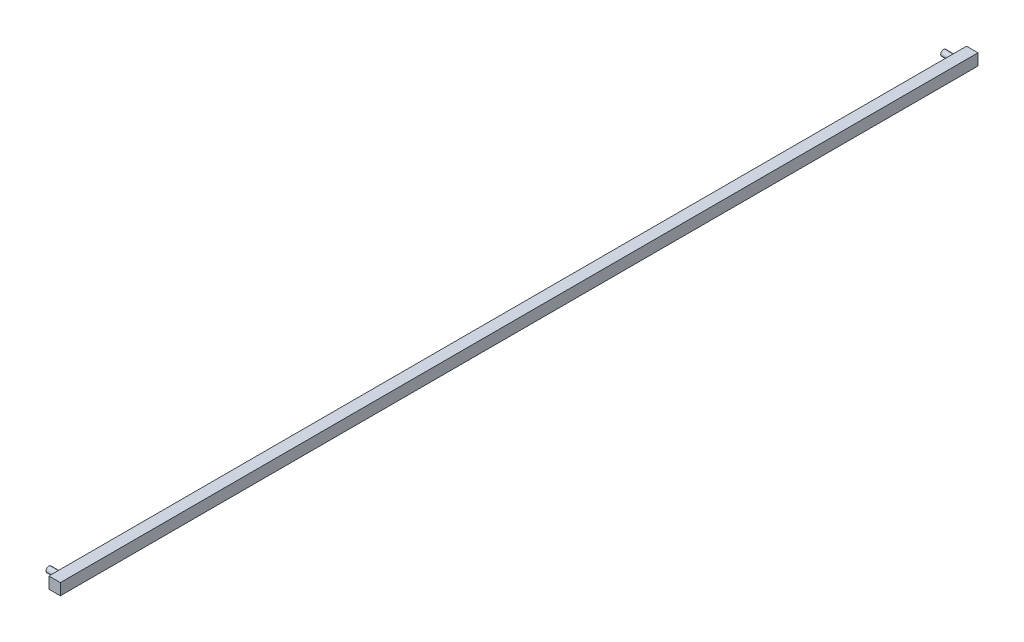
ISO-10303-21;
HEADER;
FILE_DESCRIPTION(('STEP AP214'),'2;1');
FILE_NAME('part.step','',(''),(''),'','','');
FILE_SCHEMA(('AUTOMOTIVE_DESIGN { 1 0 10303 214 1 1 1 1 }'));
ENDSEC;
DATA;
#1=APPLICATION_CONTEXT('core data for automotive mechanical design processes');
#2=APPLICATION_PROTOCOL_DEFINITION('international standard','automotive_design',2000,#1);
#3=PRODUCT_CONTEXT('',#1,'mechanical');
#4=PRODUCT('Part','Part','',(#3));
#5=PRODUCT_RELATED_PRODUCT_CATEGORY('part','',(#4));
#6=PRODUCT_DEFINITION_FORMATION('','',#4);
#7=PRODUCT_DEFINITION_CONTEXT('part definition',#1,'design');
#8=PRODUCT_DEFINITION('design','',#6,#7);
#9=PRODUCT_DEFINITION_SHAPE('','',#8);
#10=(LENGTH_UNIT() NAMED_UNIT(*) SI_UNIT(.MILLI.,.METRE.));
#11=(NAMED_UNIT(*) PLANE_ANGLE_UNIT() SI_UNIT($,.RADIAN.));
#12=(NAMED_UNIT(*) SI_UNIT($,.STERADIAN.) SOLID_ANGLE_UNIT());
#13=UNCERTAINTY_MEASURE_WITH_UNIT(LENGTH_MEASURE(1.E-05),#10,'distance_accuracy_value','');
#14=(GEOMETRIC_REPRESENTATION_CONTEXT(3) GLOBAL_UNCERTAINTY_ASSIGNED_CONTEXT((#13)) GLOBAL_UNIT_ASSIGNED_CONTEXT((#10,
#11,#12)) REPRESENTATION_CONTEXT('',''));
#15=CARTESIAN_POINT('',(0.,0.,0.));
#16=DIRECTION('',(0.,0.,1.));
#17=DIRECTION('',(1.,0.,0.));
#18=AXIS2_PLACEMENT_3D('',#15,#16,#17);
#19=CARTESIAN_POINT('',(5.,-5.,800.));
#20=DIRECTION('',(-1.,0.,0.));
#21=DIRECTION('',(0.,0.,1.));
#22=AXIS2_PLACEMENT_3D('',#19,#20,#21);
#23=PLANE('',#22);
#24=DIRECTION('',(0.,1.,0.));
#25=VECTOR('',#24,1.);
#26=CARTESIAN_POINT('',(5.,-5.,0.));
#27=LINE('',#26,#25);
#28=CARTESIAN_POINT('',(5.,-5.,0.));
#29=VERTEX_POINT('',#28);
#30=CARTESIAN_POINT('',(5.,5.,0.));
#31=VERTEX_POINT('',#30);
#32=EDGE_CURVE('E111',#29,#31,#27,.T.);
#33=ORIENTED_EDGE('',*,*,#32,.T.);
#34=DIRECTION('',(0.,0.,-1.));
#35=VECTOR('',#34,1.);
#36=CARTESIAN_POINT('',(5.,5.,800.));
#37=LINE('',#36,#35);
#38=CARTESIAN_POINT('',(5.,5.,800.));
#39=VERTEX_POINT('',#38);
#40=EDGE_CURVE('E100',#39,#31,#37,.T.);
#41=ORIENTED_EDGE('',*,*,#40,.F.);
#42=DIRECTION('',(0.,1.,0.));
#43=VECTOR('',#42,1.);
#44=CARTESIAN_POINT('',(5.,-5.,800.));
#45=LINE('',#44,#43);
#46=CARTESIAN_POINT('',(5.,-5.,800.));
#47=VERTEX_POINT('',#46);
#48=EDGE_CURVE('E92',#47,#39,#45,.T.);
#49=ORIENTED_EDGE('',*,*,#48,.F.);
#50=DIRECTION('',(0.,0.,-1.));
#51=VECTOR('',#50,1.);
#52=CARTESIAN_POINT('',(5.,-5.,800.));
#53=LINE('',#52,#51);
#54=EDGE_CURVE('E107',#47,#29,#53,.T.);
#55=ORIENTED_EDGE('',*,*,#54,.T.);
#56=EDGE_LOOP('',(#33,#41,#49,#55));
#57=FACE_BOUND('',#56,.T.);
#58=ADVANCED_FACE('F39',(#57),#23,.F.);
#59=CARTESIAN_POINT('',(-5.,5.,800.));
#60=DIRECTION('',(0.,-1.,0.));
#61=DIRECTION('',(0.,0.,-1.));
#62=AXIS2_PLACEMENT_3D('',#59,#60,#61);
#63=PLANE('',#62);
#64=DIRECTION('',(-1.,0.,0.));
#65=VECTOR('',#64,1.);
#66=CARTESIAN_POINT('',(-5.,5.,0.));
#67=LINE('',#66,#65);
#68=CARTESIAN_POINT('',(-5.,5.,0.));
#69=VERTEX_POINT('',#68);
#70=EDGE_CURVE('E98',#31,#69,#67,.T.);
#71=ORIENTED_EDGE('',*,*,#70,.T.);
#72=DIRECTION('',(0.,0.,-1.));
#73=VECTOR('',#72,1.);
#74=CARTESIAN_POINT('',(-5.,5.,800.));
#75=LINE('',#74,#73);
#76=CARTESIAN_POINT('',(-5.,5.,800.));
#77=VERTEX_POINT('',#76);
#78=EDGE_CURVE('E96',#77,#69,#75,.T.);
#79=ORIENTED_EDGE('',*,*,#78,.F.);
#80=DIRECTION('',(-1.,0.,0.));
#81=VECTOR('',#80,1.);
#82=CARTESIAN_POINT('',(-5.,5.,800.));
#83=LINE('',#82,#81);
#84=EDGE_CURVE('E87',#39,#77,#83,.T.);
#85=ORIENTED_EDGE('',*,*,#84,.F.);
#86=ORIENTED_EDGE('',*,*,#40,.T.);
#87=EDGE_LOOP('',(#71,#79,#85,#86));
#88=FACE_BOUND('',#87,.T.);
#89=ADVANCED_FACE('F97',(#88),#63,.F.);
#90=CARTESIAN_POINT('',(-5.,-5.,800.));
#91=DIRECTION('',(1.,0.,0.));
#92=DIRECTION('',(0.,0.,-1.));
#93=AXIS2_PLACEMENT_3D('',#90,#91,#92);
#94=PLANE('',#93);
#95=CARTESIAN_POINT('',(-5.,0.,790.));
#96=DIRECTION('',(1.,0.,0.));
#97=DIRECTION('',(0.,0.,-1.));
#98=AXIS2_PLACEMENT_3D('',#95,#96,#97);
#99=CIRCLE('',#98,2.49999999999991);
#100=CARTESIAN_POINT('',(-5.,0.,787.5));
#101=VERTEX_POINT('',#100);
#102=EDGE_CURVE('E11',#101,#101,#99,.F.);
#103=ORIENTED_EDGE('',*,*,#102,.F.);
#104=EDGE_LOOP('',(#103));
#105=FACE_BOUND('',#104,.T.);
#106=CARTESIAN_POINT('',(-5.,0.,10.));
#107=DIRECTION('',(1.,0.,0.));
#108=DIRECTION('',(0.,0.,-1.));
#109=AXIS2_PLACEMENT_3D('',#106,#107,#108);
#110=CIRCLE('',#109,2.5);
#111=CARTESIAN_POINT('',(-5.,0.,7.5));
#112=VERTEX_POINT('',#111);
#113=EDGE_CURVE('E48',#112,#112,#110,.F.);
#114=ORIENTED_EDGE('',*,*,#113,.F.);
#115=EDGE_LOOP('',(#114));
#116=FACE_BOUND('',#115,.T.);
#117=DIRECTION('',(0.,-1.,0.));
#118=VECTOR('',#117,1.);
#119=CARTESIAN_POINT('',(-5.,-5.,0.));
#120=LINE('',#119,#118);
#121=CARTESIAN_POINT('',(-5.,-5.,0.));
#122=VERTEX_POINT('',#121);
#123=EDGE_CURVE('E73',#69,#122,#120,.T.);
#124=ORIENTED_EDGE('',*,*,#123,.T.);
#125=DIRECTION('',(0.,0.,-1.));
#126=VECTOR('',#125,1.);
#127=CARTESIAN_POINT('',(-5.,-5.,800.));
#128=LINE('',#127,#126);
#129=CARTESIAN_POINT('',(-5.,-5.,800.));
#130=VERTEX_POINT('',#129);
#131=EDGE_CURVE('E101',#130,#122,#128,.T.);
#132=ORIENTED_EDGE('',*,*,#131,.F.);
#133=DIRECTION('',(0.,-1.,0.));
#134=VECTOR('',#133,1.);
#135=CARTESIAN_POINT('',(-5.,-5.,800.));
#136=LINE('',#135,#134);
#137=EDGE_CURVE('E90',#77,#130,#136,.T.);
#138=ORIENTED_EDGE('',*,*,#137,.F.);
#139=ORIENTED_EDGE('',*,*,#78,.T.);
#140=EDGE_LOOP('',(#124,#132,#138,#139));
#141=FACE_BOUND('',#140,.T.);
#142=ADVANCED_FACE('F103',(#105,#116,#141),#94,.F.);
#143=CARTESIAN_POINT('',(-5.,-5.,800.));
#144=DIRECTION('',(0.,1.,0.));
#145=DIRECTION('',(0.,0.,1.));
#146=AXIS2_PLACEMENT_3D('',#143,#144,#145);
#147=PLANE('',#146);
#148=DIRECTION('',(1.,0.,0.));
#149=VECTOR('',#148,1.);
#150=CARTESIAN_POINT('',(-5.,-5.,0.));
#151=LINE('',#150,#149);
#152=EDGE_CURVE('E79',#122,#29,#151,.T.);
#153=ORIENTED_EDGE('',*,*,#152,.T.);
#154=ORIENTED_EDGE('',*,*,#54,.F.);
#155=DIRECTION('',(1.,0.,0.));
#156=VECTOR('',#155,1.);
#157=CARTESIAN_POINT('',(-5.,-5.,800.));
#158=LINE('',#157,#156);
#159=EDGE_CURVE('E56',#130,#47,#158,.T.);
#160=ORIENTED_EDGE('',*,*,#159,.F.);
#161=ORIENTED_EDGE('',*,*,#131,.T.);
#162=EDGE_LOOP('',(#153,#154,#160,#161));
#163=FACE_BOUND('',#162,.T.);
#164=ADVANCED_FACE('F134',(#163),#147,.F.);
#165=CARTESIAN_POINT('',(0.,0.,800.));
#166=DIRECTION('',(0.,0.,-1.));
#167=DIRECTION('',(-1.,0.,0.));
#168=AXIS2_PLACEMENT_3D('',#165,#166,#167);
#169=PLANE('',#168);
#170=ORIENTED_EDGE('',*,*,#48,.T.);
#171=ORIENTED_EDGE('',*,*,#84,.T.);
#172=ORIENTED_EDGE('',*,*,#137,.T.);
#173=ORIENTED_EDGE('',*,*,#159,.T.);
#174=EDGE_LOOP('',(#170,#171,#172,#173));
#175=FACE_BOUND('',#174,.T.);
#176=ADVANCED_FACE('F88',(#175),#169,.F.);
#177=CARTESIAN_POINT('',(0.,0.,0.));
#178=DIRECTION('',(0.,0.,-1.));
#179=DIRECTION('',(-1.,0.,0.));
#180=AXIS2_PLACEMENT_3D('',#177,#178,#179);
#181=PLANE('',#180);
#182=ORIENTED_EDGE('',*,*,#32,.F.);
#183=ORIENTED_EDGE('',*,*,#152,.F.);
#184=ORIENTED_EDGE('',*,*,#123,.F.);
#185=ORIENTED_EDGE('',*,*,#70,.F.);
#186=EDGE_LOOP('',(#182,#183,#184,#185));
#187=FACE_BOUND('',#186,.T.);
#188=ADVANCED_FACE('F149',(#187),#181,.T.);
#189=CARTESIAN_POINT('',(-15.,0.,10.));
#190=DIRECTION('',(1.,0.,0.));
#191=DIRECTION('',(0.,0.,-1.));
#192=AXIS2_PLACEMENT_3D('',#189,#190,#191);
#193=CYLINDRICAL_SURFACE('',#192,2.5);
#194=CARTESIAN_POINT('',(-15.,0.,10.));
#195=DIRECTION('',(-1.,0.,0.));
#196=DIRECTION('',(0.,0.,1.));
#197=AXIS2_PLACEMENT_3D('',#194,#195,#196);
#198=CIRCLE('',#197,2.5);
#199=CARTESIAN_POINT('',(-15.,0.,12.5));
#200=VERTEX_POINT('',#199);
#201=EDGE_CURVE('E115',#200,#200,#198,.T.);
#202=ORIENTED_EDGE('',*,*,#201,.F.);
#203=EDGE_LOOP('',(#202));
#204=FACE_BOUND('',#203,.T.);
#205=ORIENTED_EDGE('',*,*,#113,.T.);
#206=EDGE_LOOP('',(#205));
#207=FACE_BOUND('',#206,.T.);
#208=ADVANCED_FACE('F131',(#204,#207),#193,.T.);
#209=CARTESIAN_POINT('',(-15.,0.,0.));
#210=DIRECTION('',(-1.,0.,0.));
#211=DIRECTION('',(0.,0.,1.));
#212=AXIS2_PLACEMENT_3D('',#209,#210,#211);
#213=PLANE('',#212);
#214=ORIENTED_EDGE('',*,*,#201,.T.);
#215=EDGE_LOOP('',(#214));
#216=FACE_BOUND('',#215,.T.);
#217=ADVANCED_FACE('F156',(#216),#213,.T.);
#218=CARTESIAN_POINT('',(-15.,0.,790.));
#219=DIRECTION('',(1.,0.,0.));
#220=DIRECTION('',(0.,0.,-1.));
#221=AXIS2_PLACEMENT_3D('',#218,#219,#220);
#222=CYLINDRICAL_SURFACE('',#221,2.49999999999991);
#223=CARTESIAN_POINT('',(-15.,0.,790.));
#224=DIRECTION('',(-1.,0.,0.));
#225=DIRECTION('',(0.,0.,1.));
#226=AXIS2_PLACEMENT_3D('',#223,#224,#225);
#227=CIRCLE('',#226,2.49999999999991);
#228=CARTESIAN_POINT('',(-15.,0.,792.5));
#229=VERTEX_POINT('',#228);
#230=EDGE_CURVE('E175',#229,#229,#227,.T.);
#231=ORIENTED_EDGE('',*,*,#230,.F.);
#232=EDGE_LOOP('',(#231));
#233=FACE_BOUND('',#232,.T.);
#234=ORIENTED_EDGE('',*,*,#102,.T.);
#235=EDGE_LOOP('',(#234));
#236=FACE_BOUND('',#235,.T.);
#237=ADVANCED_FACE('F163',(#233,#236),#222,.T.);
#238=CARTESIAN_POINT('',(-15.,0.,0.));
#239=DIRECTION('',(-1.,0.,0.));
#240=DIRECTION('',(0.,0.,1.));
#241=AXIS2_PLACEMENT_3D('',#238,#239,#240);
#242=PLANE('',#241);
#243=ORIENTED_EDGE('',*,*,#230,.T.);
#244=EDGE_LOOP('',(#243));
#245=FACE_BOUND('',#244,.T.);
#246=ADVANCED_FACE('F167',(#245),#242,.T.);
#247=CLOSED_SHELL('',(#58,#89,#142,#164,#176,#188,#208,#217,#237,#246));
#248=MANIFOLD_SOLID_BREP('B2',#247);
#249=ADVANCED_BREP_SHAPE_REPRESENTATION('',(#18,#248),#14);
#250=SHAPE_DEFINITION_REPRESENTATION(#9,#249);
ENDSEC;
END-ISO-10303-21;
